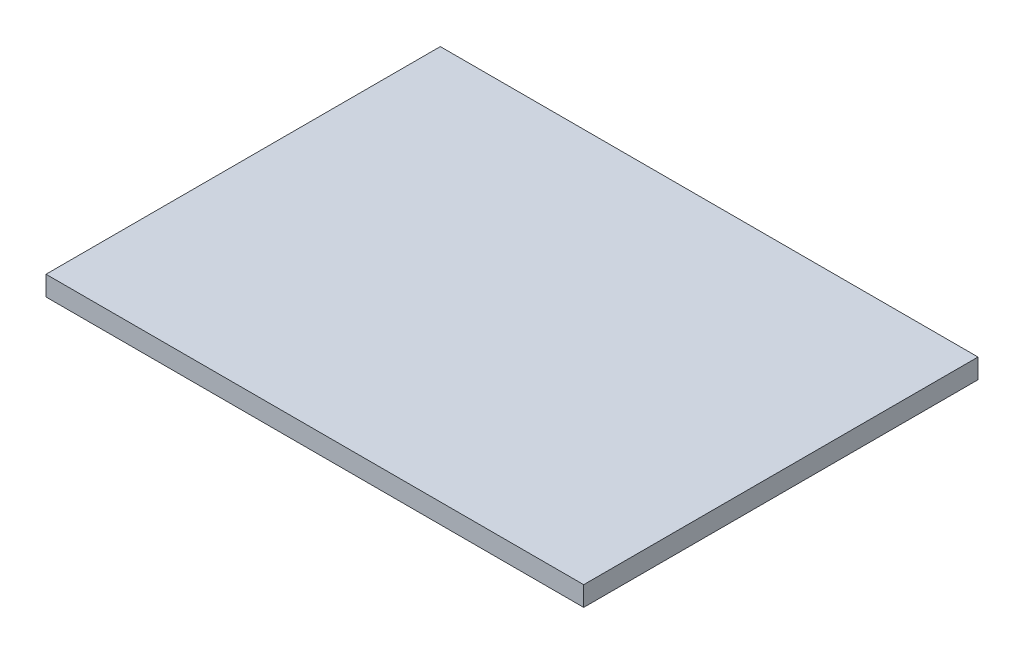
ISO-10303-21;
HEADER;
FILE_DESCRIPTION(('STEP AP214'),'2;1');
FILE_NAME('part.step','',(''),(''),'','','');
FILE_SCHEMA(('AUTOMOTIVE_DESIGN { 1 0 10303 214 1 1 1 1 }'));
ENDSEC;
DATA;
#1=APPLICATION_CONTEXT('core data for automotive mechanical design processes');
#2=APPLICATION_PROTOCOL_DEFINITION('international standard','automotive_design',2000,#1);
#3=PRODUCT_CONTEXT('',#1,'mechanical');
#4=PRODUCT('Part','Part','',(#3));
#5=PRODUCT_RELATED_PRODUCT_CATEGORY('part','',(#4));
#6=PRODUCT_DEFINITION_FORMATION('','',#4);
#7=PRODUCT_DEFINITION_CONTEXT('part definition',#1,'design');
#8=PRODUCT_DEFINITION('design','',#6,#7);
#9=PRODUCT_DEFINITION_SHAPE('','',#8);
#10=(LENGTH_UNIT() NAMED_UNIT(*) SI_UNIT(.MILLI.,.METRE.));
#11=(NAMED_UNIT(*) PLANE_ANGLE_UNIT() SI_UNIT($,.RADIAN.));
#12=(NAMED_UNIT(*) SI_UNIT($,.STERADIAN.) SOLID_ANGLE_UNIT());
#13=UNCERTAINTY_MEASURE_WITH_UNIT(LENGTH_MEASURE(1.E-05),#10,'distance_accuracy_value','');
#14=(GEOMETRIC_REPRESENTATION_CONTEXT(3) GLOBAL_UNCERTAINTY_ASSIGNED_CONTEXT((#13)) GLOBAL_UNIT_ASSIGNED_CONTEXT((#10,
#11,#12)) REPRESENTATION_CONTEXT('',''));
#15=CARTESIAN_POINT('',(0.,0.,0.));
#16=DIRECTION('',(0.,0.,1.));
#17=DIRECTION('',(1.,0.,0.));
#18=AXIS2_PLACEMENT_3D('',#15,#16,#17);
#19=CARTESIAN_POINT('',(0.,1.1,0.));
#20=DIRECTION('',(1.,0.,0.));
#21=DIRECTION('',(0.,0.,-1.));
#22=AXIS2_PLACEMENT_3D('',#19,#20,#21);
#23=PLANE('',#22);
#24=DIRECTION('',(0.,0.,1.));
#25=VECTOR('',#24,1.);
#26=CARTESIAN_POINT('',(0.,0.,0.));
#27=LINE('',#26,#25);
#28=CARTESIAN_POINT('',(0.,0.,-22.));
#29=VERTEX_POINT('',#28);
#30=CARTESIAN_POINT('',(0.,0.,0.));
#31=VERTEX_POINT('',#30);
#32=EDGE_CURVE('E102',#29,#31,#27,.T.);
#33=ORIENTED_EDGE('',*,*,#32,.T.);
#34=DIRECTION('',(0.,-1.,0.));
#35=VECTOR('',#34,1.);
#36=CARTESIAN_POINT('',(0.,1.1,0.));
#37=LINE('',#36,#35);
#38=CARTESIAN_POINT('',(0.,1.1,0.));
#39=VERTEX_POINT('',#38);
#40=EDGE_CURVE('E11',#39,#31,#37,.T.);
#41=ORIENTED_EDGE('',*,*,#40,.F.);
#42=DIRECTION('',(0.,0.,1.));
#43=VECTOR('',#42,1.);
#44=CARTESIAN_POINT('',(0.,1.1,0.));
#45=LINE('',#44,#43);
#46=CARTESIAN_POINT('',(0.,1.1,-22.));
#47=VERTEX_POINT('',#46);
#48=EDGE_CURVE('E90',#47,#39,#45,.T.);
#49=ORIENTED_EDGE('',*,*,#48,.F.);
#50=DIRECTION('',(0.,-1.,0.));
#51=VECTOR('',#50,1.);
#52=CARTESIAN_POINT('',(0.,1.1,-22.));
#53=LINE('',#52,#51);
#54=EDGE_CURVE('E98',#47,#29,#53,.T.);
#55=ORIENTED_EDGE('',*,*,#54,.T.);
#56=EDGE_LOOP('',(#33,#41,#49,#55));
#57=FACE_BOUND('',#56,.T.);
#58=ADVANCED_FACE('F39',(#57),#23,.F.);
#59=CARTESIAN_POINT('',(0.,1.1,0.));
#60=DIRECTION('',(0.,0.,-1.));
#61=DIRECTION('',(-1.,0.,0.));
#62=AXIS2_PLACEMENT_3D('',#59,#60,#61);
#63=PLANE('',#62);
#64=DIRECTION('',(1.,0.,0.));
#65=VECTOR('',#64,1.);
#66=CARTESIAN_POINT('',(0.,0.,0.));
#67=LINE('',#66,#65);
#68=CARTESIAN_POINT('',(30.,0.,0.));
#69=VERTEX_POINT('',#68);
#70=EDGE_CURVE('E94',#31,#69,#67,.T.);
#71=ORIENTED_EDGE('',*,*,#70,.T.);
#72=DIRECTION('',(0.,-1.,0.));
#73=VECTOR('',#72,1.);
#74=CARTESIAN_POINT('',(30.,1.1,0.));
#75=LINE('',#74,#73);
#76=CARTESIAN_POINT('',(30.,1.1,0.));
#77=VERTEX_POINT('',#76);
#78=EDGE_CURVE('E47',#77,#69,#75,.T.);
#79=ORIENTED_EDGE('',*,*,#78,.F.);
#80=DIRECTION('',(1.,0.,0.));
#81=VECTOR('',#80,1.);
#82=CARTESIAN_POINT('',(0.,1.1,0.));
#83=LINE('',#82,#81);
#84=EDGE_CURVE('E85',#39,#77,#83,.T.);
#85=ORIENTED_EDGE('',*,*,#84,.F.);
#86=ORIENTED_EDGE('',*,*,#40,.T.);
#87=EDGE_LOOP('',(#71,#79,#85,#86));
#88=FACE_BOUND('',#87,.T.);
#89=ADVANCED_FACE('F93',(#88),#63,.F.);
#90=CARTESIAN_POINT('',(30.,1.1,0.));
#91=DIRECTION('',(-1.,0.,0.));
#92=DIRECTION('',(0.,0.,1.));
#93=AXIS2_PLACEMENT_3D('',#90,#91,#92);
#94=PLANE('',#93);
#95=DIRECTION('',(0.,0.,-1.));
#96=VECTOR('',#95,1.);
#97=CARTESIAN_POINT('',(30.,0.,0.));
#98=LINE('',#97,#96);
#99=CARTESIAN_POINT('',(30.,0.,-22.));
#100=VERTEX_POINT('',#99);
#101=EDGE_CURVE('E72',#69,#100,#98,.T.);
#102=ORIENTED_EDGE('',*,*,#101,.T.);
#103=DIRECTION('',(0.,-1.,0.));
#104=VECTOR('',#103,1.);
#105=CARTESIAN_POINT('',(30.,1.1,-22.));
#106=LINE('',#105,#104);
#107=CARTESIAN_POINT('',(30.,1.1,-22.));
#108=VERTEX_POINT('',#107);
#109=EDGE_CURVE('E95',#108,#100,#106,.T.);
#110=ORIENTED_EDGE('',*,*,#109,.F.);
#111=DIRECTION('',(0.,0.,-1.));
#112=VECTOR('',#111,1.);
#113=CARTESIAN_POINT('',(30.,1.1,0.));
#114=LINE('',#113,#112);
#115=EDGE_CURVE('E88',#77,#108,#114,.T.);
#116=ORIENTED_EDGE('',*,*,#115,.F.);
#117=ORIENTED_EDGE('',*,*,#78,.T.);
#118=EDGE_LOOP('',(#102,#110,#116,#117));
#119=FACE_BOUND('',#118,.T.);
#120=ADVANCED_FACE('F96',(#119),#94,.F.);
#121=CARTESIAN_POINT('',(0.,1.1,-22.));
#122=DIRECTION('',(0.,0.,1.));
#123=DIRECTION('',(1.,0.,0.));
#124=AXIS2_PLACEMENT_3D('',#121,#122,#123);
#125=PLANE('',#124);
#126=DIRECTION('',(-1.,0.,0.));
#127=VECTOR('',#126,1.);
#128=CARTESIAN_POINT('',(0.,0.,-22.));
#129=LINE('',#128,#127);
#130=EDGE_CURVE('E78',#100,#29,#129,.T.);
#131=ORIENTED_EDGE('',*,*,#130,.T.);
#132=ORIENTED_EDGE('',*,*,#54,.F.);
#133=DIRECTION('',(-1.,0.,0.));
#134=VECTOR('',#133,1.);
#135=CARTESIAN_POINT('',(0.,1.1,-22.));
#136=LINE('',#135,#134);
#137=EDGE_CURVE('E55',#108,#47,#136,.T.);
#138=ORIENTED_EDGE('',*,*,#137,.F.);
#139=ORIENTED_EDGE('',*,*,#109,.T.);
#140=EDGE_LOOP('',(#131,#132,#138,#139));
#141=FACE_BOUND('',#140,.T.);
#142=ADVANCED_FACE('F109',(#141),#125,.F.);
#143=CARTESIAN_POINT('',(0.,1.1,0.));
#144=DIRECTION('',(0.,-1.,0.));
#145=DIRECTION('',(0.,0.,-1.));
#146=AXIS2_PLACEMENT_3D('',#143,#144,#145);
#147=PLANE('',#146);
#148=ORIENTED_EDGE('',*,*,#48,.T.);
#149=ORIENTED_EDGE('',*,*,#84,.T.);
#150=ORIENTED_EDGE('',*,*,#115,.T.);
#151=ORIENTED_EDGE('',*,*,#137,.T.);
#152=EDGE_LOOP('',(#148,#149,#150,#151));
#153=FACE_BOUND('',#152,.T.);
#154=ADVANCED_FACE('F86',(#153),#147,.F.);
#155=CARTESIAN_POINT('',(0.,0.,0.));
#156=DIRECTION('',(0.,-1.,0.));
#157=DIRECTION('',(0.,0.,-1.));
#158=AXIS2_PLACEMENT_3D('',#155,#156,#157);
#159=PLANE('',#158);
#160=ORIENTED_EDGE('',*,*,#32,.F.);
#161=ORIENTED_EDGE('',*,*,#130,.F.);
#162=ORIENTED_EDGE('',*,*,#101,.F.);
#163=ORIENTED_EDGE('',*,*,#70,.F.);
#164=EDGE_LOOP('',(#160,#161,#162,#163));
#165=FACE_BOUND('',#164,.T.);
#166=ADVANCED_FACE('F112',(#165),#159,.T.);
#167=CLOSED_SHELL('',(#58,#89,#120,#142,#154,#166));
#168=MANIFOLD_SOLID_BREP('B2',#167);
#169=ADVANCED_BREP_SHAPE_REPRESENTATION('',(#18,#168),#14);
#170=SHAPE_DEFINITION_REPRESENTATION(#9,#169);
ENDSEC;
END-ISO-10303-21;
